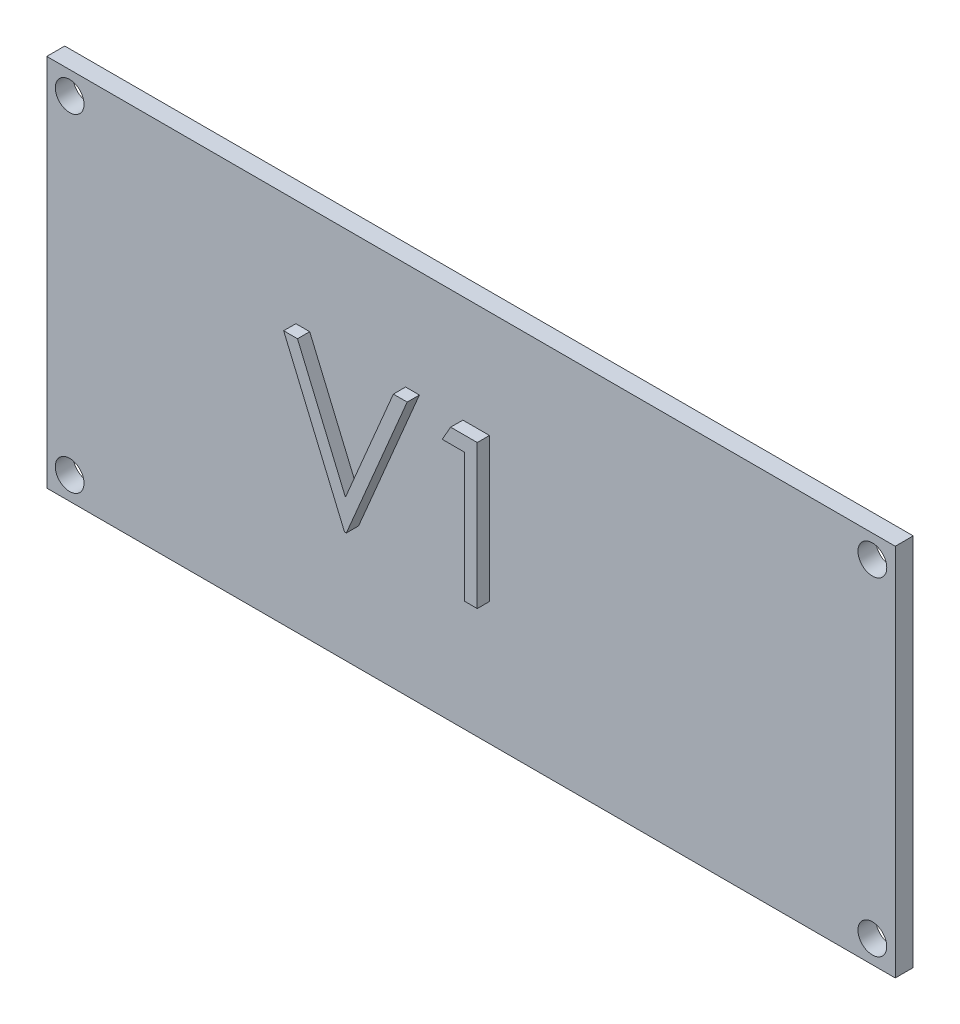
ISO-10303-21;
HEADER;
FILE_DESCRIPTION(('STEP AP214'),'2;1');
FILE_NAME('part.step','',(''),(''),'','','');
FILE_SCHEMA(('AUTOMOTIVE_DESIGN { 1 0 10303 214 1 1 1 1 }'));
ENDSEC;
DATA;
#1=APPLICATION_CONTEXT('core data for automotive mechanical design processes');
#2=APPLICATION_PROTOCOL_DEFINITION('international standard','automotive_design',2000,#1);
#3=PRODUCT_CONTEXT('',#1,'mechanical');
#4=PRODUCT('Part','Part','',(#3));
#5=PRODUCT_RELATED_PRODUCT_CATEGORY('part','',(#4));
#6=PRODUCT_DEFINITION_FORMATION('','',#4);
#7=PRODUCT_DEFINITION_CONTEXT('part definition',#1,'design');
#8=PRODUCT_DEFINITION('design','',#6,#7);
#9=PRODUCT_DEFINITION_SHAPE('','',#8);
#10=(LENGTH_UNIT() NAMED_UNIT(*) SI_UNIT(.MILLI.,.METRE.));
#11=(NAMED_UNIT(*) PLANE_ANGLE_UNIT() SI_UNIT($,.RADIAN.));
#12=(NAMED_UNIT(*) SI_UNIT($,.STERADIAN.) SOLID_ANGLE_UNIT());
#13=UNCERTAINTY_MEASURE_WITH_UNIT(LENGTH_MEASURE(1.E-05),#10,'distance_accuracy_value','');
#14=(GEOMETRIC_REPRESENTATION_CONTEXT(3) GLOBAL_UNCERTAINTY_ASSIGNED_CONTEXT((#13)) GLOBAL_UNIT_ASSIGNED_CONTEXT((#10,
#11,#12)) REPRESENTATION_CONTEXT('',''));
#15=CARTESIAN_POINT('',(0.,0.,0.));
#16=DIRECTION('',(0.,0.,1.));
#17=DIRECTION('',(1.,0.,0.));
#18=AXIS2_PLACEMENT_3D('',#15,#16,#17);
#19=CARTESIAN_POINT('',(98.1790799883061,0.,2.5));
#20=DIRECTION('',(1.,0.,0.));
#21=DIRECTION('',(0.,0.,-1.));
#22=AXIS2_PLACEMENT_3D('',#19,#20,#21);
#23=PLANE('',#22);
#24=DIRECTION('',(0.,-1.,0.));
#25=VECTOR('',#24,1.);
#26=CARTESIAN_POINT('',(98.1790799883061,0.,0.));
#27=LINE('',#26,#25);
#28=CARTESIAN_POINT('',(98.1790799883061,-80.041481737114,0.));
#29=VERTEX_POINT('',#28);
#30=CARTESIAN_POINT('',(98.1790799883061,-132.041481737114,0.));
#31=VERTEX_POINT('',#30);
#32=EDGE_CURVE('E295',#29,#31,#27,.T.);
#33=ORIENTED_EDGE('',*,*,#32,.F.);
#34=DIRECTION('',(0.,0.,-1.));
#35=VECTOR('',#34,1.);
#36=CARTESIAN_POINT('',(98.1790799883061,-80.041481737114,2.5));
#37=LINE('',#36,#35);
#38=CARTESIAN_POINT('',(98.1790799883061,-80.041481737114,2.5));
#39=VERTEX_POINT('',#38);
#40=EDGE_CURVE('E11',#39,#29,#37,.T.);
#41=ORIENTED_EDGE('',*,*,#40,.F.);
#42=DIRECTION('',(0.,-1.,0.));
#43=VECTOR('',#42,1.);
#44=CARTESIAN_POINT('',(98.1790799883061,0.,2.5));
#45=LINE('',#44,#43);
#46=CARTESIAN_POINT('',(98.1790799883061,-132.041481737114,2.5));
#47=VERTEX_POINT('',#46);
#48=EDGE_CURVE('E272',#39,#47,#45,.T.);
#49=ORIENTED_EDGE('',*,*,#48,.T.);
#50=DIRECTION('',(0.,0.,-1.));
#51=VECTOR('',#50,1.);
#52=CARTESIAN_POINT('',(98.1790799883061,-132.041481737114,2.5));
#53=LINE('',#52,#51);
#54=EDGE_CURVE('E286',#47,#31,#53,.T.);
#55=ORIENTED_EDGE('',*,*,#54,.T.);
#56=EDGE_LOOP('',(#33,#41,#49,#55));
#57=FACE_BOUND('',#56,.T.);
#58=ADVANCED_FACE('F33',(#57),#23,.T.);
#59=CARTESIAN_POINT('',(0.,-80.041481737114,2.5));
#60=DIRECTION('',(0.,1.,0.));
#61=DIRECTION('',(0.,0.,1.));
#62=AXIS2_PLACEMENT_3D('',#59,#60,#61);
#63=PLANE('',#62);
#64=DIRECTION('',(1.,0.,0.));
#65=VECTOR('',#64,1.);
#66=CARTESIAN_POINT('',(0.,-80.041481737114,0.));
#67=LINE('',#66,#65);
#68=CARTESIAN_POINT('',(-19.8209200116939,-80.041481737114,0.));
#69=VERTEX_POINT('',#68);
#70=EDGE_CURVE('E298',#69,#29,#67,.T.);
#71=ORIENTED_EDGE('',*,*,#70,.F.);
#72=DIRECTION('',(0.,0.,-1.));
#73=VECTOR('',#72,1.);
#74=CARTESIAN_POINT('',(-19.8209200116939,-80.041481737114,2.5));
#75=LINE('',#74,#73);
#76=CARTESIAN_POINT('',(-19.8209200116939,-80.041481737114,2.5));
#77=VERTEX_POINT('',#76);
#78=EDGE_CURVE('E41',#77,#69,#75,.T.);
#79=ORIENTED_EDGE('',*,*,#78,.F.);
#80=DIRECTION('',(1.,0.,0.));
#81=VECTOR('',#80,1.);
#82=CARTESIAN_POINT('',(0.,-80.041481737114,2.5));
#83=LINE('',#82,#81);
#84=EDGE_CURVE('E275',#77,#39,#83,.T.);
#85=ORIENTED_EDGE('',*,*,#84,.T.);
#86=ORIENTED_EDGE('',*,*,#40,.T.);
#87=EDGE_LOOP('',(#71,#79,#85,#86));
#88=FACE_BOUND('',#87,.T.);
#89=ADVANCED_FACE('F323',(#88),#63,.T.);
#90=CARTESIAN_POINT('',(-19.8209200116939,0.,2.5));
#91=DIRECTION('',(1.,0.,0.));
#92=DIRECTION('',(0.,0.,-1.));
#93=AXIS2_PLACEMENT_3D('',#90,#91,#92);
#94=PLANE('',#93);
#95=DIRECTION('',(0.,-1.,0.));
#96=VECTOR('',#95,1.);
#97=CARTESIAN_POINT('',(-19.8209200116939,0.,0.));
#98=LINE('',#97,#96);
#99=CARTESIAN_POINT('',(-19.8209200116939,-132.041481737114,0.));
#100=VERTEX_POINT('',#99);
#101=EDGE_CURVE('E301',#69,#100,#98,.T.);
#102=ORIENTED_EDGE('',*,*,#101,.T.);
#103=DIRECTION('',(0.,0.,-1.));
#104=VECTOR('',#103,1.);
#105=CARTESIAN_POINT('',(-19.8209200116939,-132.041481737114,2.5));
#106=LINE('',#105,#104);
#107=CARTESIAN_POINT('',(-19.8209200116939,-132.041481737114,2.5));
#108=VERTEX_POINT('',#107);
#109=EDGE_CURVE('E310',#108,#100,#106,.T.);
#110=ORIENTED_EDGE('',*,*,#109,.F.);
#111=DIRECTION('',(0.,-1.,0.));
#112=VECTOR('',#111,1.);
#113=CARTESIAN_POINT('',(-19.8209200116939,0.,2.5));
#114=LINE('',#113,#112);
#115=EDGE_CURVE('E278',#77,#108,#114,.T.);
#116=ORIENTED_EDGE('',*,*,#115,.F.);
#117=ORIENTED_EDGE('',*,*,#78,.T.);
#118=EDGE_LOOP('',(#102,#110,#116,#117));
#119=FACE_BOUND('',#118,.T.);
#120=ADVANCED_FACE('F315',(#119),#94,.F.);
#121=CARTESIAN_POINT('',(0.,-132.041481737114,2.5));
#122=DIRECTION('',(0.,1.,0.));
#123=DIRECTION('',(0.,0.,1.));
#124=AXIS2_PLACEMENT_3D('',#121,#122,#123);
#125=PLANE('',#124);
#126=DIRECTION('',(1.,0.,0.));
#127=VECTOR('',#126,1.);
#128=CARTESIAN_POINT('',(0.,-132.041481737114,0.));
#129=LINE('',#128,#127);
#130=EDGE_CURVE('E304',#100,#31,#129,.T.);
#131=ORIENTED_EDGE('',*,*,#130,.T.);
#132=ORIENTED_EDGE('',*,*,#54,.F.);
#133=DIRECTION('',(1.,0.,0.));
#134=VECTOR('',#133,1.);
#135=CARTESIAN_POINT('',(0.,-132.041481737114,2.5));
#136=LINE('',#135,#134);
#137=EDGE_CURVE('E281',#108,#47,#136,.T.);
#138=ORIENTED_EDGE('',*,*,#137,.F.);
#139=ORIENTED_EDGE('',*,*,#109,.T.);
#140=EDGE_LOOP('',(#131,#132,#138,#139));
#141=FACE_BOUND('',#140,.T.);
#142=ADVANCED_FACE('F329',(#141),#125,.F.);
#143=CARTESIAN_POINT('',(94.9970994729666,-128.859501221774,2.5));
#144=DIRECTION('',(0.,0.,-1.));
#145=DIRECTION('',(-1.,0.,0.));
#146=AXIS2_PLACEMENT_3D('',#143,#144,#145);
#147=CYLINDRICAL_SURFACE('',#146,2.00000000000001);
#148=CARTESIAN_POINT('',(94.9970994729666,-128.859501221774,2.5));
#149=DIRECTION('',(0.,0.,1.));
#150=DIRECTION('',(1.,0.,0.));
#151=AXIS2_PLACEMENT_3D('',#148,#149,#150);
#152=CIRCLE('',#151,2.00000000000001);
#153=CARTESIAN_POINT('',(96.9970994729666,-128.859501221774,2.5));
#154=VERTEX_POINT('',#153);
#155=EDGE_CURVE('E269',#154,#154,#152,.F.);
#156=ORIENTED_EDGE('',*,*,#155,.F.);
#157=EDGE_LOOP('',(#156));
#158=FACE_BOUND('',#157,.T.);
#159=CARTESIAN_POINT('',(94.9970994729666,-128.859501221774,0.));
#160=DIRECTION('',(0.,0.,1.));
#161=DIRECTION('',(1.,0.,0.));
#162=AXIS2_PLACEMENT_3D('',#159,#160,#161);
#163=CIRCLE('',#162,2.00000000000001);
#164=CARTESIAN_POINT('',(96.9970994729666,-128.859501221774,0.));
#165=VERTEX_POINT('',#164);
#166=EDGE_CURVE('E292',#165,#165,#163,.F.);
#167=ORIENTED_EDGE('',*,*,#166,.T.);
#168=EDGE_LOOP('',(#167));
#169=FACE_BOUND('',#168,.T.);
#170=ADVANCED_FACE('F362',(#158,#169),#147,.F.);
#171=CARTESIAN_POINT('',(-16.6389394963545,-128.859501221774,2.5));
#172=DIRECTION('',(0.,0.,-1.));
#173=DIRECTION('',(-1.,0.,0.));
#174=AXIS2_PLACEMENT_3D('',#171,#172,#173);
#175=CYLINDRICAL_SURFACE('',#174,2.00000000000001);
#176=CARTESIAN_POINT('',(-16.6389394963545,-128.859501221774,2.5));
#177=DIRECTION('',(0.,0.,1.));
#178=DIRECTION('',(1.,0.,0.));
#179=AXIS2_PLACEMENT_3D('',#176,#177,#178);
#180=CIRCLE('',#179,2.00000000000001);
#181=CARTESIAN_POINT('',(-14.6389394963545,-128.859501221774,2.5));
#182=VERTEX_POINT('',#181);
#183=EDGE_CURVE('E265',#182,#182,#180,.T.);
#184=ORIENTED_EDGE('',*,*,#183,.T.);
#185=EDGE_LOOP('',(#184));
#186=FACE_BOUND('',#185,.T.);
#187=CARTESIAN_POINT('',(-16.6389394963545,-128.859501221774,0.));
#188=DIRECTION('',(0.,0.,1.));
#189=DIRECTION('',(1.,0.,0.));
#190=AXIS2_PLACEMENT_3D('',#187,#188,#189);
#191=CIRCLE('',#190,2.00000000000001);
#192=CARTESIAN_POINT('',(-14.6389394963545,-128.859501221774,0.));
#193=VERTEX_POINT('',#192);
#194=EDGE_CURVE('E289',#193,#193,#191,.T.);
#195=ORIENTED_EDGE('',*,*,#194,.F.);
#196=EDGE_LOOP('',(#195));
#197=FACE_BOUND('',#196,.T.);
#198=ADVANCED_FACE('F364',(#186,#197),#175,.F.);
#199=CARTESIAN_POINT('',(-16.6389394963545,-83.2234622524534,2.5));
#200=DIRECTION('',(0.,0.,-1.));
#201=DIRECTION('',(-1.,0.,0.));
#202=AXIS2_PLACEMENT_3D('',#199,#200,#201);
#203=CYLINDRICAL_SURFACE('',#202,2.00000000000001);
#204=CARTESIAN_POINT('',(-16.6389394963545,-83.2234622524534,2.5));
#205=DIRECTION('',(0.,0.,1.));
#206=DIRECTION('',(1.,0.,0.));
#207=AXIS2_PLACEMENT_3D('',#204,#205,#206);
#208=CIRCLE('',#207,2.00000000000001);
#209=CARTESIAN_POINT('',(-14.6389394963545,-83.2234622524534,2.5));
#210=VERTEX_POINT('',#209);
#211=EDGE_CURVE('E262',#210,#210,#208,.F.);
#212=ORIENTED_EDGE('',*,*,#211,.F.);
#213=EDGE_LOOP('',(#212));
#214=FACE_BOUND('',#213,.T.);
#215=CARTESIAN_POINT('',(-16.6389394963545,-83.2234622524534,0.));
#216=DIRECTION('',(0.,0.,1.));
#217=DIRECTION('',(1.,0.,0.));
#218=AXIS2_PLACEMENT_3D('',#215,#216,#217);
#219=CIRCLE('',#218,2.00000000000001);
#220=CARTESIAN_POINT('',(-14.6389394963545,-83.2234622524534,0.));
#221=VERTEX_POINT('',#220);
#222=EDGE_CURVE('E244',#221,#221,#219,.F.);
#223=ORIENTED_EDGE('',*,*,#222,.T.);
#224=EDGE_LOOP('',(#223));
#225=FACE_BOUND('',#224,.T.);
#226=ADVANCED_FACE('F35',(#214,#225),#203,.F.);
#227=CARTESIAN_POINT('',(94.9970994729665,-83.2234622524534,2.5));
#228=DIRECTION('',(0.,0.,-1.));
#229=DIRECTION('',(-1.,0.,0.));
#230=AXIS2_PLACEMENT_3D('',#227,#228,#229);
#231=CYLINDRICAL_SURFACE('',#230,2.00000000000001);
#232=CARTESIAN_POINT('',(94.9970994729665,-83.2234622524534,2.5));
#233=DIRECTION('',(0.,0.,1.));
#234=DIRECTION('',(1.,0.,0.));
#235=AXIS2_PLACEMENT_3D('',#232,#233,#234);
#236=CIRCLE('',#235,2.00000000000001);
#237=CARTESIAN_POINT('',(96.9970994729666,-83.2234622524534,2.5));
#238=VERTEX_POINT('',#237);
#239=EDGE_CURVE('E283',#238,#238,#236,.T.);
#240=ORIENTED_EDGE('',*,*,#239,.T.);
#241=EDGE_LOOP('',(#240));
#242=FACE_BOUND('',#241,.T.);
#243=CARTESIAN_POINT('',(94.9970994729665,-83.2234622524534,0.));
#244=DIRECTION('',(0.,0.,1.));
#245=DIRECTION('',(1.,0.,0.));
#246=AXIS2_PLACEMENT_3D('',#243,#244,#245);
#247=CIRCLE('',#246,2.00000000000001);
#248=CARTESIAN_POINT('',(96.9970994729666,-83.2234622524534,0.));
#249=VERTEX_POINT('',#248);
#250=EDGE_CURVE('E266',#249,#249,#247,.T.);
#251=ORIENTED_EDGE('',*,*,#250,.F.);
#252=EDGE_LOOP('',(#251));
#253=FACE_BOUND('',#252,.T.);
#254=ADVANCED_FACE('F334',(#242,#253),#231,.F.);
#255=CARTESIAN_POINT('',(0.,0.,2.5));
#256=DIRECTION('',(0.,0.,1.));
#257=DIRECTION('',(1.,0.,0.));
#258=AXIS2_PLACEMENT_3D('',#255,#256,#257);
#259=PLANE('',#258);
#260=DIRECTION('',(0.496686511837682,0.86793001385971,0.));
#261=VECTOR('',#260,1.);
#262=CARTESIAN_POINT('',(36.8744269392086,-96.965384512794,2.5));
#263=LINE('',#262,#261);
#264=CARTESIAN_POINT('',(36.8744269392086,-96.965384512794,2.5));
#265=VERTEX_POINT('',#264);
#266=CARTESIAN_POINT('',(38.0483051443368,-94.9141024615119,2.5));
#267=VERTEX_POINT('',#266);
#268=EDGE_CURVE('E187',#265,#267,#263,.T.);
#269=ORIENTED_EDGE('',*,*,#268,.T.);
#270=DIRECTION('',(1.,0.,0.));
#271=VECTOR('',#270,1.);
#272=CARTESIAN_POINT('',(38.0483051443368,-94.9141024615119,2.5));
#273=LINE('',#272,#271);
#274=CARTESIAN_POINT('',(41.7462218110035,-94.9141024615119,2.5));
#275=VERTEX_POINT('',#274);
#276=EDGE_CURVE('E156',#267,#275,#273,.T.);
#277=ORIENTED_EDGE('',*,*,#276,.T.);
#278=DIRECTION('',(0.,-1.,0.));
#279=VECTOR('',#278,1.);
#280=CARTESIAN_POINT('',(41.7462218110035,-94.9141024615119,2.5));
#281=LINE('',#280,#279);
#282=CARTESIAN_POINT('',(41.7462218110035,-114.914102461512,2.5));
#283=VERTEX_POINT('',#282);
#284=EDGE_CURVE('E190',#275,#283,#281,.T.);
#285=ORIENTED_EDGE('',*,*,#284,.T.);
#286=DIRECTION('',(-1.,0.,0.));
#287=VECTOR('',#286,1.);
#288=CARTESIAN_POINT('',(41.7462218110035,-114.914102461512,2.5));
#289=LINE('',#288,#287);
#290=CARTESIAN_POINT('',(39.9513500161317,-114.914102461512,2.5));
#291=VERTEX_POINT('',#290);
#292=EDGE_CURVE('E192',#283,#291,#289,.T.);
#293=ORIENTED_EDGE('',*,*,#292,.T.);
#294=DIRECTION('',(0.,1.,0.));
#295=VECTOR('',#294,1.);
#296=CARTESIAN_POINT('',(39.9513500161317,-114.914102461512,2.5));
#297=LINE('',#296,#295);
#298=CARTESIAN_POINT('',(39.9513500161317,-96.965384512794,2.5));
#299=VERTEX_POINT('',#298);
#300=EDGE_CURVE('E53',#291,#299,#297,.T.);
#301=ORIENTED_EDGE('',*,*,#300,.T.);
#302=DIRECTION('',(-1.,0.,0.));
#303=VECTOR('',#302,1.);
#304=CARTESIAN_POINT('',(39.9513500161317,-96.965384512794,2.5));
#305=LINE('',#304,#303);
#306=EDGE_CURVE('E48',#299,#265,#305,.T.);
#307=ORIENTED_EDGE('',*,*,#306,.T.);
#308=EDGE_LOOP('',(#269,#277,#285,#293,#301,#307));
#309=FACE_BOUND('',#308,.T.);
#310=DIRECTION('',(-0.389639990836698,0.920967251068559,0.));
#311=VECTOR('',#310,1.);
#312=CARTESIAN_POINT('',(23.284683349465,-114.914102461512,2.5));
#313=LINE('',#312,#311);
#314=CARTESIAN_POINT('',(23.284683349465,-114.914102461512,2.5));
#315=VERTEX_POINT('',#314);
#316=CARTESIAN_POINT('',(14.8231448879265,-94.9141024615119,2.5));
#317=VERTEX_POINT('',#316);
#318=EDGE_CURVE('E196',#315,#317,#313,.T.);
#319=ORIENTED_EDGE('',*,*,#318,.T.);
#320=DIRECTION('',(1.,0.,0.));
#321=VECTOR('',#320,1.);
#322=CARTESIAN_POINT('',(14.8231448879265,-94.9141024615119,2.5));
#323=LINE('',#322,#321);
#324=CARTESIAN_POINT('',(16.7462218110035,-94.9141024615119,2.5));
#325=VERTEX_POINT('',#324);
#326=EDGE_CURVE('E230',#317,#325,#323,.T.);
#327=ORIENTED_EDGE('',*,*,#326,.T.);
#328=DIRECTION('',(0.389563616454194,-0.920999559573798,0.));
#329=VECTOR('',#328,1.);
#330=CARTESIAN_POINT('',(16.7462218110035,-94.9141024615119,2.5));
#331=LINE('',#330,#329);
#332=CARTESIAN_POINT('',(23.4128884776701,-110.67532041023,2.5));
#333=VERTEX_POINT('',#332);
#334=EDGE_CURVE('E232',#325,#333,#331,.T.);
#335=ORIENTED_EDGE('',*,*,#334,.T.);
#336=DIRECTION('',(0.389563616454194,0.920999559573798,0.));
#337=VECTOR('',#336,1.);
#338=CARTESIAN_POINT('',(23.4128884776701,-110.67532041023,2.5));
#339=LINE('',#338,#337);
#340=CARTESIAN_POINT('',(30.0795551443368,-94.9141024615119,2.5));
#341=VERTEX_POINT('',#340);
#342=EDGE_CURVE('E234',#333,#341,#339,.T.);
#343=ORIENTED_EDGE('',*,*,#342,.T.);
#344=DIRECTION('',(1.,0.,0.));
#345=VECTOR('',#344,1.);
#346=CARTESIAN_POINT('',(30.0795551443368,-94.9141024615119,2.5));
#347=LINE('',#346,#345);
#348=CARTESIAN_POINT('',(32.0026320674137,-94.9141024615119,2.5));
#349=VERTEX_POINT('',#348);
#350=EDGE_CURVE('E236',#341,#349,#347,.T.);
#351=ORIENTED_EDGE('',*,*,#350,.T.);
#352=DIRECTION('',(-0.389639990836698,-0.920967251068559,0.));
#353=VECTOR('',#352,1.);
#354=CARTESIAN_POINT('',(32.0026320674137,-94.9141024615119,2.5));
#355=LINE('',#354,#353);
#356=CARTESIAN_POINT('',(23.5410936058752,-114.914102461512,2.5));
#357=VERTEX_POINT('',#356);
#358=EDGE_CURVE('E238',#349,#357,#355,.T.);
#359=ORIENTED_EDGE('',*,*,#358,.T.);
#360=DIRECTION('',(-1.,0.,0.));
#361=VECTOR('',#360,1.);
#362=CARTESIAN_POINT('',(23.5410936058753,-114.914102461512,2.5));
#363=LINE('',#362,#361);
#364=EDGE_CURVE('E210',#357,#315,#363,.T.);
#365=ORIENTED_EDGE('',*,*,#364,.T.);
#366=EDGE_LOOP('',(#319,#327,#335,#343,#351,#359,#365));
#367=FACE_BOUND('',#366,.T.);
#368=ORIENTED_EDGE('',*,*,#211,.T.);
#369=EDGE_LOOP('',(#368));
#370=FACE_BOUND('',#369,.T.);
#371=ORIENTED_EDGE('',*,*,#183,.F.);
#372=EDGE_LOOP('',(#371));
#373=FACE_BOUND('',#372,.T.);
#374=ORIENTED_EDGE('',*,*,#155,.T.);
#375=EDGE_LOOP('',(#374));
#376=FACE_BOUND('',#375,.T.);
#377=ORIENTED_EDGE('',*,*,#48,.F.);
#378=ORIENTED_EDGE('',*,*,#84,.F.);
#379=ORIENTED_EDGE('',*,*,#115,.T.);
#380=ORIENTED_EDGE('',*,*,#137,.T.);
#381=EDGE_LOOP('',(#377,#378,#379,#380));
#382=FACE_BOUND('',#381,.T.);
#383=ORIENTED_EDGE('',*,*,#239,.F.);
#384=EDGE_LOOP('',(#383));
#385=FACE_BOUND('',#384,.T.);
#386=ADVANCED_FACE('F331',(#309,#367,#370,#373,#376,#382,#385),#259,.T.);
#387=CARTESIAN_POINT('',(0.,0.,0.));
#388=DIRECTION('',(0.,0.,1.));
#389=DIRECTION('',(1.,0.,0.));
#390=AXIS2_PLACEMENT_3D('',#387,#388,#389);
#391=PLANE('',#390);
#392=ORIENTED_EDGE('',*,*,#222,.F.);
#393=EDGE_LOOP('',(#392));
#394=FACE_BOUND('',#393,.T.);
#395=ORIENTED_EDGE('',*,*,#194,.T.);
#396=EDGE_LOOP('',(#395));
#397=FACE_BOUND('',#396,.T.);
#398=ORIENTED_EDGE('',*,*,#166,.F.);
#399=EDGE_LOOP('',(#398));
#400=FACE_BOUND('',#399,.T.);
#401=ORIENTED_EDGE('',*,*,#32,.T.);
#402=ORIENTED_EDGE('',*,*,#130,.F.);
#403=ORIENTED_EDGE('',*,*,#101,.F.);
#404=ORIENTED_EDGE('',*,*,#70,.T.);
#405=EDGE_LOOP('',(#401,#402,#403,#404));
#406=FACE_BOUND('',#405,.T.);
#407=ORIENTED_EDGE('',*,*,#250,.T.);
#408=EDGE_LOOP('',(#407));
#409=FACE_BOUND('',#408,.T.);
#410=ADVANCED_FACE('F321',(#394,#397,#400,#406,#409),#391,.F.);
#411=CARTESIAN_POINT('',(23.284683349465,-114.914102461512,4.2));
#412=DIRECTION('',(-0.920967251068559,-0.389639990836698,0.));
#413=DIRECTION('',(0.389639990836698,-0.920967251068559,0.));
#414=AXIS2_PLACEMENT_3D('',#411,#412,#413);
#415=PLANE('',#414);
#416=ORIENTED_EDGE('',*,*,#318,.F.);
#417=DIRECTION('',(0.,0.,-1.));
#418=VECTOR('',#417,1.);
#419=CARTESIAN_POINT('',(23.284683349465,-114.914102461512,4.2));
#420=LINE('',#419,#418);
#421=CARTESIAN_POINT('',(23.284683349465,-114.914102461512,4.2));
#422=VERTEX_POINT('',#421);
#423=EDGE_CURVE('E241',#422,#315,#420,.T.);
#424=ORIENTED_EDGE('',*,*,#423,.F.);
#425=DIRECTION('',(-0.389639990836698,0.920967251068559,0.));
#426=VECTOR('',#425,1.);
#427=CARTESIAN_POINT('',(23.284683349465,-114.914102461512,4.2));
#428=LINE('',#427,#426);
#429=CARTESIAN_POINT('',(14.8231448879265,-94.9141024615119,4.2));
#430=VERTEX_POINT('',#429);
#431=EDGE_CURVE('E206',#422,#430,#428,.T.);
#432=ORIENTED_EDGE('',*,*,#431,.T.);
#433=DIRECTION('',(0.,0.,-1.));
#434=VECTOR('',#433,1.);
#435=CARTESIAN_POINT('',(14.8231448879265,-94.9141024615119,4.2));
#436=LINE('',#435,#434);
#437=EDGE_CURVE('E228',#430,#317,#436,.T.);
#438=ORIENTED_EDGE('',*,*,#437,.T.);
#439=EDGE_LOOP('',(#416,#424,#432,#438));
#440=FACE_BOUND('',#439,.T.);
#441=ADVANCED_FACE('F343',(#440),#415,.T.);
#442=CARTESIAN_POINT('',(23.5410936058753,-114.914102461512,4.2));
#443=DIRECTION('',(0.,-1.,0.));
#444=DIRECTION('',(0.,0.,-1.));
#445=AXIS2_PLACEMENT_3D('',#442,#443,#444);
#446=PLANE('',#445);
#447=ORIENTED_EDGE('',*,*,#364,.F.);
#448=DIRECTION('',(0.,0.,-1.));
#449=VECTOR('',#448,1.);
#450=CARTESIAN_POINT('',(23.5410936058753,-114.914102461512,4.2));
#451=LINE('',#450,#449);
#452=CARTESIAN_POINT('',(23.5410936058753,-114.914102461512,4.2));
#453=VERTEX_POINT('',#452);
#454=EDGE_CURVE('E245',#453,#357,#451,.T.);
#455=ORIENTED_EDGE('',*,*,#454,.F.);
#456=DIRECTION('',(-1.,0.,0.));
#457=VECTOR('',#456,1.);
#458=CARTESIAN_POINT('',(23.5410936058753,-114.914102461512,4.2));
#459=LINE('',#458,#457);
#460=EDGE_CURVE('E225',#453,#422,#459,.T.);
#461=ORIENTED_EDGE('',*,*,#460,.T.);
#462=ORIENTED_EDGE('',*,*,#423,.T.);
#463=EDGE_LOOP('',(#447,#455,#461,#462));
#464=FACE_BOUND('',#463,.T.);
#465=ADVANCED_FACE('F349',(#464),#446,.T.);
#466=CARTESIAN_POINT('',(32.0026320674137,-94.9141024615119,4.2));
#467=DIRECTION('',(0.920967251068559,-0.389639990836698,0.));
#468=DIRECTION('',(0.389639990836698,0.920967251068559,0.));
#469=AXIS2_PLACEMENT_3D('',#466,#467,#468);
#470=PLANE('',#469);
#471=ORIENTED_EDGE('',*,*,#358,.F.);
#472=DIRECTION('',(0.,0.,-1.));
#473=VECTOR('',#472,1.);
#474=CARTESIAN_POINT('',(32.0026320674137,-94.9141024615119,4.2));
#475=LINE('',#474,#473);
#476=CARTESIAN_POINT('',(32.0026320674137,-94.9141024615119,4.2));
#477=VERTEX_POINT('',#476);
#478=EDGE_CURVE('E248',#477,#349,#475,.T.);
#479=ORIENTED_EDGE('',*,*,#478,.F.);
#480=DIRECTION('',(-0.389639990836698,-0.920967251068559,0.));
#481=VECTOR('',#480,1.);
#482=CARTESIAN_POINT('',(32.0026320674137,-94.9141024615119,4.2));
#483=LINE('',#482,#481);
#484=EDGE_CURVE('E222',#477,#453,#483,.T.);
#485=ORIENTED_EDGE('',*,*,#484,.T.);
#486=ORIENTED_EDGE('',*,*,#454,.T.);
#487=EDGE_LOOP('',(#471,#479,#485,#486));
#488=FACE_BOUND('',#487,.T.);
#489=ADVANCED_FACE('F411',(#488),#470,.T.);
#490=CARTESIAN_POINT('',(30.0795551443368,-94.9141024615119,4.2));
#491=DIRECTION('',(0.,1.,0.));
#492=DIRECTION('',(0.,0.,1.));
#493=AXIS2_PLACEMENT_3D('',#490,#491,#492);
#494=PLANE('',#493);
#495=ORIENTED_EDGE('',*,*,#350,.F.);
#496=DIRECTION('',(0.,0.,-1.));
#497=VECTOR('',#496,1.);
#498=CARTESIAN_POINT('',(30.0795551443368,-94.9141024615119,4.2));
#499=LINE('',#498,#497);
#500=CARTESIAN_POINT('',(30.0795551443368,-94.9141024615119,4.2));
#501=VERTEX_POINT('',#500);
#502=EDGE_CURVE('E251',#501,#341,#499,.T.);
#503=ORIENTED_EDGE('',*,*,#502,.F.);
#504=DIRECTION('',(1.,0.,0.));
#505=VECTOR('',#504,1.);
#506=CARTESIAN_POINT('',(30.0795551443368,-94.9141024615119,4.2));
#507=LINE('',#506,#505);
#508=EDGE_CURVE('E219',#501,#477,#507,.T.);
#509=ORIENTED_EDGE('',*,*,#508,.T.);
#510=ORIENTED_EDGE('',*,*,#478,.T.);
#511=EDGE_LOOP('',(#495,#503,#509,#510));
#512=FACE_BOUND('',#511,.T.);
#513=ADVANCED_FACE('F421',(#512),#494,.T.);
#514=CARTESIAN_POINT('',(23.4128884776701,-110.67532041023,4.2));
#515=DIRECTION('',(-0.920999559573798,0.389563616454194,0.));
#516=DIRECTION('',(-0.389563616454194,-0.920999559573798,0.));
#517=AXIS2_PLACEMENT_3D('',#514,#515,#516);
#518=PLANE('',#517);
#519=ORIENTED_EDGE('',*,*,#342,.F.);
#520=DIRECTION('',(0.,0.,-1.));
#521=VECTOR('',#520,1.);
#522=CARTESIAN_POINT('',(23.4128884776701,-110.67532041023,4.2));
#523=LINE('',#522,#521);
#524=CARTESIAN_POINT('',(23.4128884776701,-110.67532041023,4.2));
#525=VERTEX_POINT('',#524);
#526=EDGE_CURVE('E254',#525,#333,#523,.T.);
#527=ORIENTED_EDGE('',*,*,#526,.F.);
#528=DIRECTION('',(0.389563616454194,0.920999559573798,0.));
#529=VECTOR('',#528,1.);
#530=CARTESIAN_POINT('',(23.4128884776701,-110.67532041023,4.2));
#531=LINE('',#530,#529);
#532=EDGE_CURVE('E216',#525,#501,#531,.T.);
#533=ORIENTED_EDGE('',*,*,#532,.T.);
#534=ORIENTED_EDGE('',*,*,#502,.T.);
#535=EDGE_LOOP('',(#519,#527,#533,#534));
#536=FACE_BOUND('',#535,.T.);
#537=ADVANCED_FACE('F431',(#536),#518,.T.);
#538=CARTESIAN_POINT('',(16.7462218110035,-94.9141024615119,4.2));
#539=DIRECTION('',(0.920999559573798,0.389563616454194,0.));
#540=DIRECTION('',(-0.389563616454194,0.920999559573798,0.));
#541=AXIS2_PLACEMENT_3D('',#538,#539,#540);
#542=PLANE('',#541);
#543=ORIENTED_EDGE('',*,*,#334,.F.);
#544=DIRECTION('',(0.,0.,-1.));
#545=VECTOR('',#544,1.);
#546=CARTESIAN_POINT('',(16.7462218110035,-94.9141024615119,4.2));
#547=LINE('',#546,#545);
#548=CARTESIAN_POINT('',(16.7462218110035,-94.9141024615119,4.2));
#549=VERTEX_POINT('',#548);
#550=EDGE_CURVE('E257',#549,#325,#547,.T.);
#551=ORIENTED_EDGE('',*,*,#550,.F.);
#552=DIRECTION('',(0.389563616454194,-0.920999559573798,0.));
#553=VECTOR('',#552,1.);
#554=CARTESIAN_POINT('',(16.7462218110035,-94.9141024615119,4.2));
#555=LINE('',#554,#553);
#556=EDGE_CURVE('E213',#549,#525,#555,.T.);
#557=ORIENTED_EDGE('',*,*,#556,.T.);
#558=ORIENTED_EDGE('',*,*,#526,.T.);
#559=EDGE_LOOP('',(#543,#551,#557,#558));
#560=FACE_BOUND('',#559,.T.);
#561=ADVANCED_FACE('F441',(#560),#542,.T.);
#562=CARTESIAN_POINT('',(14.8231448879265,-94.9141024615119,4.2));
#563=DIRECTION('',(0.,1.,0.));
#564=DIRECTION('',(0.,0.,1.));
#565=AXIS2_PLACEMENT_3D('',#562,#563,#564);
#566=PLANE('',#565);
#567=ORIENTED_EDGE('',*,*,#326,.F.);
#568=ORIENTED_EDGE('',*,*,#437,.F.);
#569=DIRECTION('',(1.,0.,0.));
#570=VECTOR('',#569,1.);
#571=CARTESIAN_POINT('',(14.8231448879265,-94.9141024615119,4.2));
#572=LINE('',#571,#570);
#573=EDGE_CURVE('E209',#430,#549,#572,.T.);
#574=ORIENTED_EDGE('',*,*,#573,.T.);
#575=ORIENTED_EDGE('',*,*,#550,.T.);
#576=EDGE_LOOP('',(#567,#568,#574,#575));
#577=FACE_BOUND('',#576,.T.);
#578=ADVANCED_FACE('F451',(#577),#566,.T.);
#579=CARTESIAN_POINT('',(0.,0.,4.2));
#580=DIRECTION('',(0.,0.,-1.));
#581=DIRECTION('',(-1.,0.,0.));
#582=AXIS2_PLACEMENT_3D('',#579,#580,#581);
#583=PLANE('',#582);
#584=ORIENTED_EDGE('',*,*,#431,.F.);
#585=ORIENTED_EDGE('',*,*,#460,.F.);
#586=ORIENTED_EDGE('',*,*,#484,.F.);
#587=ORIENTED_EDGE('',*,*,#508,.F.);
#588=ORIENTED_EDGE('',*,*,#532,.F.);
#589=ORIENTED_EDGE('',*,*,#556,.F.);
#590=ORIENTED_EDGE('',*,*,#573,.F.);
#591=EDGE_LOOP('',(#584,#585,#586,#587,#588,#589,#590));
#592=FACE_BOUND('',#591,.T.);
#593=ADVANCED_FACE('F461',(#592),#583,.F.);
#594=CARTESIAN_POINT('',(36.8744269392086,-96.965384512794,4.2));
#595=DIRECTION('',(-0.86793001385971,0.496686511837682,0.));
#596=DIRECTION('',(-0.496686511837682,-0.86793001385971,0.));
#597=AXIS2_PLACEMENT_3D('',#594,#595,#596);
#598=PLANE('',#597);
#599=ORIENTED_EDGE('',*,*,#268,.F.);
#600=DIRECTION('',(0.,0.,-1.));
#601=VECTOR('',#600,1.);
#602=CARTESIAN_POINT('',(36.8744269392086,-96.965384512794,4.2));
#603=LINE('',#602,#601);
#604=CARTESIAN_POINT('',(36.8744269392086,-96.965384512794,4.2));
#605=VERTEX_POINT('',#604);
#606=EDGE_CURVE('E175',#605,#265,#603,.T.);
#607=ORIENTED_EDGE('',*,*,#606,.F.);
#608=DIRECTION('',(0.496686511837682,0.86793001385971,0.));
#609=VECTOR('',#608,1.);
#610=CARTESIAN_POINT('',(36.8744269392086,-96.965384512794,4.2));
#611=LINE('',#610,#609);
#612=CARTESIAN_POINT('',(38.0483051443368,-94.9141024615119,4.2));
#613=VERTEX_POINT('',#612);
#614=EDGE_CURVE('E168',#605,#613,#611,.T.);
#615=ORIENTED_EDGE('',*,*,#614,.T.);
#616=DIRECTION('',(0.,0.,-1.));
#617=VECTOR('',#616,1.);
#618=CARTESIAN_POINT('',(38.0483051443368,-94.9141024615119,4.2));
#619=LINE('',#618,#617);
#620=EDGE_CURVE('E151',#613,#267,#619,.T.);
#621=ORIENTED_EDGE('',*,*,#620,.T.);
#622=EDGE_LOOP('',(#599,#607,#615,#621));
#623=FACE_BOUND('',#622,.T.);
#624=ADVANCED_FACE('F174',(#623),#598,.T.);
#625=CARTESIAN_POINT('',(39.9513500161317,-96.965384512794,4.2));
#626=DIRECTION('',(0.,-1.,0.));
#627=DIRECTION('',(0.,0.,-1.));
#628=AXIS2_PLACEMENT_3D('',#625,#626,#627);
#629=PLANE('',#628);
#630=ORIENTED_EDGE('',*,*,#306,.F.);
#631=DIRECTION('',(0.,0.,-1.));
#632=VECTOR('',#631,1.);
#633=CARTESIAN_POINT('',(39.9513500161317,-96.965384512794,4.2));
#634=LINE('',#633,#632);
#635=CARTESIAN_POINT('',(39.9513500161317,-96.965384512794,4.2));
#636=VERTEX_POINT('',#635);
#637=EDGE_CURVE('E197',#636,#299,#634,.T.);
#638=ORIENTED_EDGE('',*,*,#637,.F.);
#639=DIRECTION('',(-1.,0.,0.));
#640=VECTOR('',#639,1.);
#641=CARTESIAN_POINT('',(39.9513500161317,-96.965384512794,4.2));
#642=LINE('',#641,#640);
#643=EDGE_CURVE('E161',#636,#605,#642,.T.);
#644=ORIENTED_EDGE('',*,*,#643,.T.);
#645=ORIENTED_EDGE('',*,*,#606,.T.);
#646=EDGE_LOOP('',(#630,#638,#644,#645));
#647=FACE_BOUND('',#646,.T.);
#648=ADVANCED_FACE('F480',(#647),#629,.T.);
#649=CARTESIAN_POINT('',(39.9513500161317,-114.914102461512,4.2));
#650=DIRECTION('',(-1.,0.,0.));
#651=DIRECTION('',(0.,0.,1.));
#652=AXIS2_PLACEMENT_3D('',#649,#650,#651);
#653=PLANE('',#652);
#654=ORIENTED_EDGE('',*,*,#300,.F.);
#655=DIRECTION('',(0.,0.,-1.));
#656=VECTOR('',#655,1.);
#657=CARTESIAN_POINT('',(39.9513500161317,-114.914102461512,4.2));
#658=LINE('',#657,#656);
#659=CARTESIAN_POINT('',(39.9513500161317,-114.914102461512,4.2));
#660=VERTEX_POINT('',#659);
#661=EDGE_CURVE('E199',#660,#291,#658,.T.);
#662=ORIENTED_EDGE('',*,*,#661,.F.);
#663=DIRECTION('',(0.,1.,0.));
#664=VECTOR('',#663,1.);
#665=CARTESIAN_POINT('',(39.9513500161317,-114.914102461512,4.2));
#666=LINE('',#665,#664);
#667=EDGE_CURVE('E183',#660,#636,#666,.T.);
#668=ORIENTED_EDGE('',*,*,#667,.T.);
#669=ORIENTED_EDGE('',*,*,#637,.T.);
#670=EDGE_LOOP('',(#654,#662,#668,#669));
#671=FACE_BOUND('',#670,.T.);
#672=ADVANCED_FACE('F489',(#671),#653,.T.);
#673=CARTESIAN_POINT('',(41.7462218110035,-114.914102461512,4.2));
#674=DIRECTION('',(0.,-1.,0.));
#675=DIRECTION('',(0.,0.,-1.));
#676=AXIS2_PLACEMENT_3D('',#673,#674,#675);
#677=PLANE('',#676);
#678=ORIENTED_EDGE('',*,*,#292,.F.);
#679=DIRECTION('',(0.,0.,-1.));
#680=VECTOR('',#679,1.);
#681=CARTESIAN_POINT('',(41.7462218110035,-114.914102461512,4.2));
#682=LINE('',#681,#680);
#683=CARTESIAN_POINT('',(41.7462218110035,-114.914102461512,4.2));
#684=VERTEX_POINT('',#683);
#685=EDGE_CURVE('E202',#684,#283,#682,.T.);
#686=ORIENTED_EDGE('',*,*,#685,.F.);
#687=DIRECTION('',(-1.,0.,0.));
#688=VECTOR('',#687,1.);
#689=CARTESIAN_POINT('',(41.7462218110035,-114.914102461512,4.2));
#690=LINE('',#689,#688);
#691=EDGE_CURVE('E180',#684,#660,#690,.T.);
#692=ORIENTED_EDGE('',*,*,#691,.T.);
#693=ORIENTED_EDGE('',*,*,#661,.T.);
#694=EDGE_LOOP('',(#678,#686,#692,#693));
#695=FACE_BOUND('',#694,.T.);
#696=ADVANCED_FACE('F499',(#695),#677,.T.);
#697=CARTESIAN_POINT('',(41.7462218110035,-94.9141024615119,4.2));
#698=DIRECTION('',(1.,0.,0.));
#699=DIRECTION('',(0.,0.,-1.));
#700=AXIS2_PLACEMENT_3D('',#697,#698,#699);
#701=PLANE('',#700);
#702=ORIENTED_EDGE('',*,*,#284,.F.);
#703=DIRECTION('',(0.,0.,-1.));
#704=VECTOR('',#703,1.);
#705=CARTESIAN_POINT('',(41.7462218110035,-94.9141024615119,4.2));
#706=LINE('',#705,#704);
#707=CARTESIAN_POINT('',(41.7462218110035,-94.9141024615119,4.2));
#708=VERTEX_POINT('',#707);
#709=EDGE_CURVE('E160',#708,#275,#706,.T.);
#710=ORIENTED_EDGE('',*,*,#709,.F.);
#711=DIRECTION('',(0.,-1.,0.));
#712=VECTOR('',#711,1.);
#713=CARTESIAN_POINT('',(41.7462218110035,-94.9141024615119,4.2));
#714=LINE('',#713,#712);
#715=EDGE_CURVE('E172',#708,#684,#714,.T.);
#716=ORIENTED_EDGE('',*,*,#715,.T.);
#717=ORIENTED_EDGE('',*,*,#685,.T.);
#718=EDGE_LOOP('',(#702,#710,#716,#717));
#719=FACE_BOUND('',#718,.T.);
#720=ADVANCED_FACE('F509',(#719),#701,.T.);
#721=CARTESIAN_POINT('',(38.0483051443368,-94.9141024615119,4.2));
#722=DIRECTION('',(0.,1.,0.));
#723=DIRECTION('',(0.,0.,1.));
#724=AXIS2_PLACEMENT_3D('',#721,#722,#723);
#725=PLANE('',#724);
#726=ORIENTED_EDGE('',*,*,#276,.F.);
#727=ORIENTED_EDGE('',*,*,#620,.F.);
#728=DIRECTION('',(1.,0.,0.));
#729=VECTOR('',#728,1.);
#730=CARTESIAN_POINT('',(38.0483051443368,-94.9141024615119,4.2));
#731=LINE('',#730,#729);
#732=EDGE_CURVE('E155',#613,#708,#731,.T.);
#733=ORIENTED_EDGE('',*,*,#732,.T.);
#734=ORIENTED_EDGE('',*,*,#709,.T.);
#735=EDGE_LOOP('',(#726,#727,#733,#734));
#736=FACE_BOUND('',#735,.T.);
#737=ADVANCED_FACE('F153',(#736),#725,.T.);
#738=CARTESIAN_POINT('',(0.,0.,4.2));
#739=DIRECTION('',(0.,0.,-1.));
#740=DIRECTION('',(-1.,0.,0.));
#741=AXIS2_PLACEMENT_3D('',#738,#739,#740);
#742=PLANE('',#741);
#743=ORIENTED_EDGE('',*,*,#614,.F.);
#744=ORIENTED_EDGE('',*,*,#643,.F.);
#745=ORIENTED_EDGE('',*,*,#667,.F.);
#746=ORIENTED_EDGE('',*,*,#691,.F.);
#747=ORIENTED_EDGE('',*,*,#715,.F.);
#748=ORIENTED_EDGE('',*,*,#732,.F.);
#749=EDGE_LOOP('',(#743,#744,#745,#746,#747,#748));
#750=FACE_BOUND('',#749,.T.);
#751=ADVANCED_FACE('F166',(#750),#742,.F.);
#752=CLOSED_SHELL('',(#58,#89,#120,#142,#170,#198,#226,#254,#386,#410,#441,#465,#489,#513,#537,
#561,#578,#593,#624,#648,#672,#696,#720,#737,#751));
#753=MANIFOLD_SOLID_BREP('B2',#752);
#754=ADVANCED_BREP_SHAPE_REPRESENTATION('',(#18,#753),#14);
#755=SHAPE_DEFINITION_REPRESENTATION(#9,#754);
ENDSEC;
END-ISO-10303-21;
